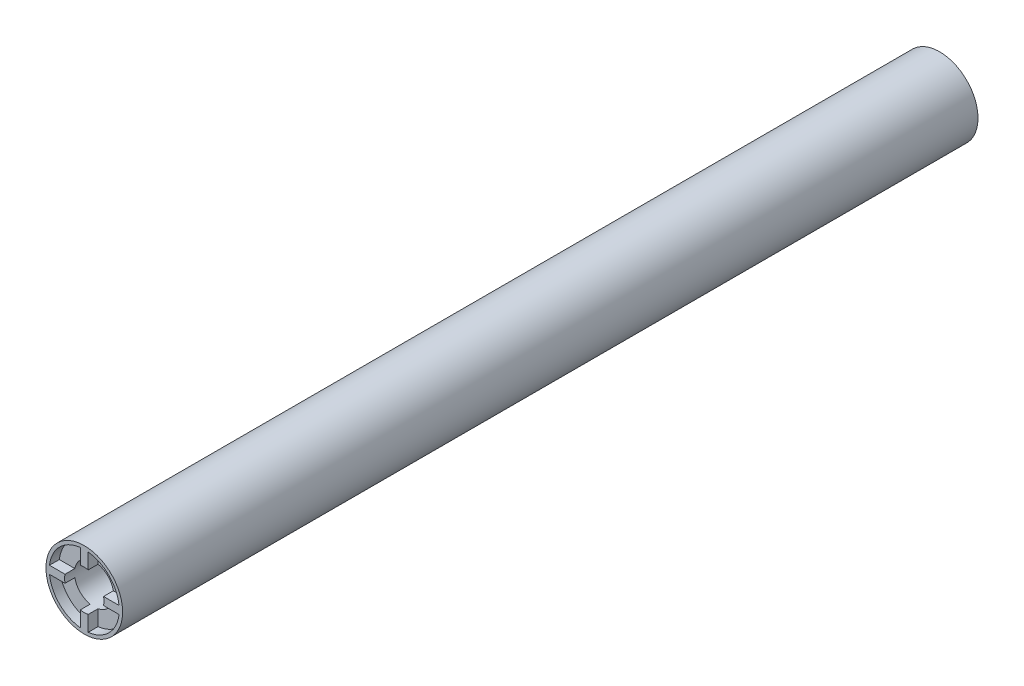
ISO-10303-21;
HEADER;
FILE_DESCRIPTION(('STEP AP214'),'2;1');
FILE_NAME('part.step','',(''),(''),'','','');
FILE_SCHEMA(('AUTOMOTIVE_DESIGN { 1 0 10303 214 1 1 1 1 }'));
ENDSEC;
DATA;
#1=APPLICATION_CONTEXT('core data for automotive mechanical design processes');
#2=APPLICATION_PROTOCOL_DEFINITION('international standard','automotive_design',2000,#1);
#3=PRODUCT_CONTEXT('',#1,'mechanical');
#4=PRODUCT('Part','Part','',(#3));
#5=PRODUCT_RELATED_PRODUCT_CATEGORY('part','',(#4));
#6=PRODUCT_DEFINITION_FORMATION('','',#4);
#7=PRODUCT_DEFINITION_CONTEXT('part definition',#1,'design');
#8=PRODUCT_DEFINITION('design','',#6,#7);
#9=PRODUCT_DEFINITION_SHAPE('','',#8);
#10=(LENGTH_UNIT() NAMED_UNIT(*) SI_UNIT(.MILLI.,.METRE.));
#11=(NAMED_UNIT(*) PLANE_ANGLE_UNIT() SI_UNIT($,.RADIAN.));
#12=(NAMED_UNIT(*) SI_UNIT($,.STERADIAN.) SOLID_ANGLE_UNIT());
#13=UNCERTAINTY_MEASURE_WITH_UNIT(LENGTH_MEASURE(1.E-05),#10,'distance_accuracy_value','');
#14=(GEOMETRIC_REPRESENTATION_CONTEXT(3) GLOBAL_UNCERTAINTY_ASSIGNED_CONTEXT((#13)) GLOBAL_UNIT_ASSIGNED_CONTEXT((#10,
#11,#12)) REPRESENTATION_CONTEXT('',''));
#15=CARTESIAN_POINT('',(0.,0.,0.));
#16=DIRECTION('',(0.,0.,1.));
#17=DIRECTION('',(1.,0.,0.));
#18=AXIS2_PLACEMENT_3D('',#15,#16,#17);
#19=CARTESIAN_POINT('',(0.,0.,0.));
#20=DIRECTION('',(0.,0.,1.));
#21=DIRECTION('',(1.,0.,0.));
#22=AXIS2_PLACEMENT_3D('',#19,#20,#21);
#23=PLANE('',#22);
#24=CARTESIAN_POINT('',(0.,0.,0.));
#25=DIRECTION('',(0.,0.,1.));
#26=DIRECTION('',(1.,0.,0.));
#27=AXIS2_PLACEMENT_3D('',#24,#25,#26);
#28=CIRCLE('',#27,1.);
#29=CARTESIAN_POINT('',(0.2,-0.979795897113271,0.));
#30=VERTEX_POINT('',#29);
#31=CARTESIAN_POINT('',(0.979795897113271,-0.2,0.));
#32=VERTEX_POINT('',#31);
#33=EDGE_CURVE('E158',#30,#32,#28,.T.);
#34=ORIENTED_EDGE('',*,*,#33,.F.);
#35=DIRECTION('',(0.,-1.,0.));
#36=VECTOR('',#35,1.);
#37=CARTESIAN_POINT('',(0.2,0.,0.));
#38=LINE('',#37,#36);
#39=CARTESIAN_POINT('',(0.2,-1.76872835675804,0.));
#40=VERTEX_POINT('',#39);
#41=EDGE_CURVE('E51',#30,#40,#38,.T.);
#42=ORIENTED_EDGE('',*,*,#41,.T.);
#43=CARTESIAN_POINT('',(0.,0.,0.));
#44=DIRECTION('',(0.,0.,1.));
#45=DIRECTION('',(1.,0.,0.));
#46=AXIS2_PLACEMENT_3D('',#43,#44,#45);
#47=CIRCLE('',#46,1.78);
#48=CARTESIAN_POINT('',(1.76872835675804,-0.2,0.));
#49=VERTEX_POINT('',#48);
#50=EDGE_CURVE('E56',#40,#49,#47,.T.);
#51=ORIENTED_EDGE('',*,*,#50,.T.);
#52=DIRECTION('',(1.,0.,0.));
#53=VECTOR('',#52,1.);
#54=CARTESIAN_POINT('',(0.,-0.2,0.));
#55=LINE('',#54,#53);
#56=EDGE_CURVE('E231',#32,#49,#55,.T.);
#57=ORIENTED_EDGE('',*,*,#56,.F.);
#58=EDGE_LOOP('',(#34,#42,#51,#57));
#59=FACE_BOUND('',#58,.T.);
#60=ADVANCED_FACE('F36',(#59),#23,.T.);
#61=CARTESIAN_POINT('',(0.979795897113271,0.2,0.));
#62=VERTEX_POINT('',#61);
#63=CARTESIAN_POINT('',(0.2,0.979795897113271,0.));
#64=VERTEX_POINT('',#63);
#65=EDGE_CURVE('E278',#62,#64,#28,.T.);
#66=ORIENTED_EDGE('',*,*,#65,.F.);
#67=DIRECTION('',(1.,0.,0.));
#68=VECTOR('',#67,1.);
#69=CARTESIAN_POINT('',(0.,0.2,0.));
#70=LINE('',#69,#68);
#71=CARTESIAN_POINT('',(1.76872835675804,0.2,0.));
#72=VERTEX_POINT('',#71);
#73=EDGE_CURVE('E229',#62,#72,#70,.T.);
#74=ORIENTED_EDGE('',*,*,#73,.T.);
#75=CARTESIAN_POINT('',(0.,0.,0.));
#76=DIRECTION('',(0.,0.,1.));
#77=DIRECTION('',(1.,0.,0.));
#78=AXIS2_PLACEMENT_3D('',#75,#76,#77);
#79=CIRCLE('',#78,1.78);
#80=CARTESIAN_POINT('',(0.2,1.76872835675804,0.));
#81=VERTEX_POINT('',#80);
#82=EDGE_CURVE('E227',#72,#81,#79,.T.);
#83=ORIENTED_EDGE('',*,*,#82,.T.);
#84=DIRECTION('',(0.,-1.,0.));
#85=VECTOR('',#84,1.);
#86=CARTESIAN_POINT('',(0.2,0.,0.));
#87=LINE('',#86,#85);
#88=EDGE_CURVE('E225',#81,#64,#87,.T.);
#89=ORIENTED_EDGE('',*,*,#88,.T.);
#90=EDGE_LOOP('',(#66,#74,#83,#89));
#91=FACE_BOUND('',#90,.T.);
#92=ADVANCED_FACE('F304',(#91),#23,.T.);
#93=DIRECTION('',(0.,-1.,0.));
#94=VECTOR('',#93,1.);
#95=CARTESIAN_POINT('',(-0.2,0.,0.));
#96=LINE('',#95,#94);
#97=CARTESIAN_POINT('',(-0.2,1.76872835675804,0.));
#98=VERTEX_POINT('',#97);
#99=CARTESIAN_POINT('',(-0.2,0.979795897113271,0.));
#100=VERTEX_POINT('',#99);
#101=EDGE_CURVE('E222',#98,#100,#96,.T.);
#102=ORIENTED_EDGE('',*,*,#101,.F.);
#103=CARTESIAN_POINT('',(0.,0.,0.));
#104=DIRECTION('',(0.,0.,1.));
#105=DIRECTION('',(1.,0.,0.));
#106=AXIS2_PLACEMENT_3D('',#103,#104,#105);
#107=CIRCLE('',#106,1.78);
#108=CARTESIAN_POINT('',(-1.76872835675804,0.2,0.));
#109=VERTEX_POINT('',#108);
#110=EDGE_CURVE('E220',#98,#109,#107,.T.);
#111=ORIENTED_EDGE('',*,*,#110,.T.);
#112=DIRECTION('',(1.,0.,0.));
#113=VECTOR('',#112,1.);
#114=CARTESIAN_POINT('',(0.,0.2,0.));
#115=LINE('',#114,#113);
#116=CARTESIAN_POINT('',(-0.979795897113271,0.2,0.));
#117=VERTEX_POINT('',#116);
#118=EDGE_CURVE('E218',#109,#117,#115,.T.);
#119=ORIENTED_EDGE('',*,*,#118,.T.);
#120=EDGE_CURVE('E280',#100,#117,#28,.T.);
#121=ORIENTED_EDGE('',*,*,#120,.F.);
#122=EDGE_LOOP('',(#102,#111,#119,#121));
#123=FACE_BOUND('',#122,.T.);
#124=ADVANCED_FACE('F309',(#123),#23,.T.);
#125=DIRECTION('',(0.,-1.,0.));
#126=VECTOR('',#125,1.);
#127=CARTESIAN_POINT('',(-0.2,0.,0.));
#128=LINE('',#127,#126);
#129=CARTESIAN_POINT('',(-0.2,-0.979795897113271,0.));
#130=VERTEX_POINT('',#129);
#131=CARTESIAN_POINT('',(-0.2,-1.76872835675804,0.));
#132=VERTEX_POINT('',#131);
#133=EDGE_CURVE('E176',#130,#132,#128,.T.);
#134=ORIENTED_EDGE('',*,*,#133,.F.);
#135=CARTESIAN_POINT('',(-0.979795897113271,-0.2,0.));
#136=VERTEX_POINT('',#135);
#137=EDGE_CURVE('E284',#136,#130,#28,.T.);
#138=ORIENTED_EDGE('',*,*,#137,.F.);
#139=DIRECTION('',(1.,0.,0.));
#140=VECTOR('',#139,1.);
#141=CARTESIAN_POINT('',(0.,-0.2,0.));
#142=LINE('',#141,#140);
#143=CARTESIAN_POINT('',(-1.76872835675804,-0.2,0.));
#144=VERTEX_POINT('',#143);
#145=EDGE_CURVE('E216',#144,#136,#142,.T.);
#146=ORIENTED_EDGE('',*,*,#145,.F.);
#147=CARTESIAN_POINT('',(0.,0.,0.));
#148=DIRECTION('',(0.,0.,1.));
#149=DIRECTION('',(1.,0.,0.));
#150=AXIS2_PLACEMENT_3D('',#147,#148,#149);
#151=CIRCLE('',#150,1.78);
#152=EDGE_CURVE('E155',#144,#132,#151,.T.);
#153=ORIENTED_EDGE('',*,*,#152,.T.);
#154=EDGE_LOOP('',(#134,#138,#146,#153));
#155=FACE_BOUND('',#154,.T.);
#156=ADVANCED_FACE('F305',(#155),#23,.T.);
#157=CARTESIAN_POINT('',(0.,0.,-8.));
#158=DIRECTION('',(0.,0.,1.));
#159=DIRECTION('',(1.,0.,0.));
#160=AXIS2_PLACEMENT_3D('',#157,#158,#159);
#161=CYLINDRICAL_SURFACE('',#160,1.);
#162=CARTESIAN_POINT('',(0.,0.,-8.));
#163=DIRECTION('',(0.,0.,1.));
#164=DIRECTION('',(1.,0.,0.));
#165=AXIS2_PLACEMENT_3D('',#162,#163,#164);
#166=CIRCLE('',#165,1.);
#167=CARTESIAN_POINT('',(1.,0.,-8.));
#168=VERTEX_POINT('',#167);
#169=EDGE_CURVE('E44',#168,#168,#166,.T.);
#170=ORIENTED_EDGE('',*,*,#169,.F.);
#171=EDGE_LOOP('',(#170));
#172=FACE_BOUND('',#171,.T.);
#173=ORIENTED_EDGE('',*,*,#65,.T.);
#174=DIRECTION('',(0.,0.,-1.));
#175=VECTOR('',#174,1.);
#176=CARTESIAN_POINT('',(0.2,0.979795897113271,0.5));
#177=LINE('',#176,#175);
#178=CARTESIAN_POINT('',(0.2,0.979795897113271,0.5));
#179=VERTEX_POINT('',#178);
#180=EDGE_CURVE('E261',#179,#64,#177,.T.);
#181=ORIENTED_EDGE('',*,*,#180,.F.);
#182=CARTESIAN_POINT('',(0.,0.,0.5));
#183=DIRECTION('',(0.,0.,1.));
#184=DIRECTION('',(1.,0.,0.));
#185=AXIS2_PLACEMENT_3D('',#182,#183,#184);
#186=CIRCLE('',#185,1.);
#187=CARTESIAN_POINT('',(-0.2,0.979795897113271,0.5));
#188=VERTEX_POINT('',#187);
#189=EDGE_CURVE('E189',#188,#179,#186,.F.);
#190=ORIENTED_EDGE('',*,*,#189,.F.);
#191=DIRECTION('',(0.,0.,-1.));
#192=VECTOR('',#191,1.);
#193=CARTESIAN_POINT('',(-0.2,0.979795897113271,0.5));
#194=LINE('',#193,#192);
#195=EDGE_CURVE('E264',#188,#100,#194,.T.);
#196=ORIENTED_EDGE('',*,*,#195,.T.);
#197=ORIENTED_EDGE('',*,*,#120,.T.);
#198=DIRECTION('',(0.,0.,-1.));
#199=VECTOR('',#198,1.);
#200=CARTESIAN_POINT('',(-0.979795897113271,0.2,0.5));
#201=LINE('',#200,#199);
#202=CARTESIAN_POINT('',(-0.979795897113271,0.2,0.5));
#203=VERTEX_POINT('',#202);
#204=EDGE_CURVE('E273',#203,#117,#201,.T.);
#205=ORIENTED_EDGE('',*,*,#204,.F.);
#206=CARTESIAN_POINT('',(0.,0.,0.5));
#207=DIRECTION('',(0.,0.,1.));
#208=DIRECTION('',(1.,0.,0.));
#209=AXIS2_PLACEMENT_3D('',#206,#207,#208);
#210=CIRCLE('',#209,1.);
#211=CARTESIAN_POINT('',(-0.979795897113271,-0.2,0.5));
#212=VERTEX_POINT('',#211);
#213=EDGE_CURVE('E167',#212,#203,#210,.F.);
#214=ORIENTED_EDGE('',*,*,#213,.F.);
#215=DIRECTION('',(0.,0.,-1.));
#216=VECTOR('',#215,1.);
#217=CARTESIAN_POINT('',(-0.979795897113271,-0.2,0.5));
#218=LINE('',#217,#216);
#219=EDGE_CURVE('E159',#212,#136,#218,.T.);
#220=ORIENTED_EDGE('',*,*,#219,.T.);
#221=ORIENTED_EDGE('',*,*,#137,.T.);
#222=DIRECTION('',(0.,0.,-1.));
#223=VECTOR('',#222,1.);
#224=CARTESIAN_POINT('',(-0.2,-0.979795897113271,0.5));
#225=LINE('',#224,#223);
#226=CARTESIAN_POINT('',(-0.2,-0.979795897113271,0.5));
#227=VERTEX_POINT('',#226);
#228=EDGE_CURVE('E239',#227,#130,#225,.T.);
#229=ORIENTED_EDGE('',*,*,#228,.F.);
#230=CARTESIAN_POINT('',(0.,0.,0.5));
#231=DIRECTION('',(0.,0.,1.));
#232=DIRECTION('',(1.,0.,0.));
#233=AXIS2_PLACEMENT_3D('',#230,#231,#232);
#234=CIRCLE('',#233,1.);
#235=CARTESIAN_POINT('',(0.2,-0.979795897113271,0.5));
#236=VERTEX_POINT('',#235);
#237=EDGE_CURVE('E211',#236,#227,#234,.F.);
#238=ORIENTED_EDGE('',*,*,#237,.F.);
#239=DIRECTION('',(0.,0.,-1.));
#240=VECTOR('',#239,1.);
#241=CARTESIAN_POINT('',(0.2,-0.979795897113271,0.5));
#242=LINE('',#241,#240);
#243=EDGE_CURVE('E242',#236,#30,#242,.T.);
#244=ORIENTED_EDGE('',*,*,#243,.T.);
#245=ORIENTED_EDGE('',*,*,#33,.T.);
#246=DIRECTION('',(0.,0.,-1.));
#247=VECTOR('',#246,1.);
#248=CARTESIAN_POINT('',(0.979795897113271,-0.2,0.5));
#249=LINE('',#248,#247);
#250=CARTESIAN_POINT('',(0.979795897113271,-0.2,0.5));
#251=VERTEX_POINT('',#250);
#252=EDGE_CURVE('E249',#251,#32,#249,.T.);
#253=ORIENTED_EDGE('',*,*,#252,.F.);
#254=CARTESIAN_POINT('',(0.,0.,0.5));
#255=DIRECTION('',(0.,0.,1.));
#256=DIRECTION('',(1.,0.,0.));
#257=AXIS2_PLACEMENT_3D('',#254,#255,#256);
#258=CIRCLE('',#257,1.);
#259=CARTESIAN_POINT('',(0.979795897113271,0.2,0.5));
#260=VERTEX_POINT('',#259);
#261=EDGE_CURVE('E200',#260,#251,#258,.F.);
#262=ORIENTED_EDGE('',*,*,#261,.F.);
#263=DIRECTION('',(0.,0.,-1.));
#264=VECTOR('',#263,1.);
#265=CARTESIAN_POINT('',(0.979795897113271,0.2,0.5));
#266=LINE('',#265,#264);
#267=EDGE_CURVE('E252',#260,#62,#266,.T.);
#268=ORIENTED_EDGE('',*,*,#267,.T.);
#269=EDGE_LOOP('',(#173,#181,#190,#196,#197,#205,#214,#220,#221,#229,#238,#244,#245,#253,#262,#268));
#270=FACE_BOUND('',#269,.T.);
#271=ADVANCED_FACE('F289',(#172,#270),#161,.F.);
#272=CARTESIAN_POINT('',(0.,0.,-8.));
#273=DIRECTION('',(0.,0.,1.));
#274=DIRECTION('',(1.,0.,0.));
#275=AXIS2_PLACEMENT_3D('',#272,#273,#274);
#276=PLANE('',#275);
#277=ORIENTED_EDGE('',*,*,#169,.T.);
#278=EDGE_LOOP('',(#277));
#279=FACE_BOUND('',#278,.T.);
#280=ADVANCED_FACE('F317',(#279),#276,.T.);
#281=CARTESIAN_POINT('',(0.,0.,0.5));
#282=DIRECTION('',(0.,0.,-1.));
#283=DIRECTION('',(-1.,0.,0.));
#284=AXIS2_PLACEMENT_3D('',#281,#282,#283);
#285=CYLINDRICAL_SURFACE('',#284,1.78);
#286=ORIENTED_EDGE('',*,*,#152,.F.);
#287=DIRECTION('',(0.,0.,-1.));
#288=VECTOR('',#287,1.);
#289=CARTESIAN_POINT('',(-1.76872835675804,-0.2,0.5));
#290=LINE('',#289,#288);
#291=CARTESIAN_POINT('',(-1.76872835675804,-0.2,0.5));
#292=VERTEX_POINT('',#291);
#293=EDGE_CURVE('E149',#292,#144,#290,.T.);
#294=ORIENTED_EDGE('',*,*,#293,.F.);
#295=CARTESIAN_POINT('',(0.,0.,0.5));
#296=DIRECTION('',(0.,0.,1.));
#297=DIRECTION('',(1.,0.,0.));
#298=AXIS2_PLACEMENT_3D('',#295,#296,#297);
#299=CIRCLE('',#298,1.78);
#300=CARTESIAN_POINT('',(-0.2,-1.76872835675804,0.5));
#301=VERTEX_POINT('',#300);
#302=EDGE_CURVE('E154',#292,#301,#299,.T.);
#303=ORIENTED_EDGE('',*,*,#302,.T.);
#304=DIRECTION('',(0.,0.,-1.));
#305=VECTOR('',#304,1.);
#306=CARTESIAN_POINT('',(-0.2,-1.76872835675804,0.5));
#307=LINE('',#306,#305);
#308=EDGE_CURVE('E214',#301,#132,#307,.T.);
#309=ORIENTED_EDGE('',*,*,#308,.T.);
#310=EDGE_LOOP('',(#286,#294,#303,#309));
#311=FACE_BOUND('',#310,.T.);
#312=ADVANCED_FACE('F151',(#311),#285,.F.);
#313=CARTESIAN_POINT('',(0.,-0.2,0.5));
#314=DIRECTION('',(0.,1.,0.));
#315=DIRECTION('',(-1.,0.,0.));
#316=AXIS2_PLACEMENT_3D('',#313,#314,#315);
#317=PLANE('',#316);
#318=ORIENTED_EDGE('',*,*,#145,.T.);
#319=ORIENTED_EDGE('',*,*,#219,.F.);
#320=DIRECTION('',(1.,0.,0.));
#321=VECTOR('',#320,1.);
#322=CARTESIAN_POINT('',(0.,-0.2,0.5));
#323=LINE('',#322,#321);
#324=EDGE_CURVE('E163',#292,#212,#323,.T.);
#325=ORIENTED_EDGE('',*,*,#324,.F.);
#326=ORIENTED_EDGE('',*,*,#293,.T.);
#327=EDGE_LOOP('',(#318,#319,#325,#326));
#328=FACE_BOUND('',#327,.T.);
#329=ADVANCED_FACE('F164',(#328),#317,.F.);
#330=CARTESIAN_POINT('',(0.,0.2,0.5));
#331=DIRECTION('',(0.,1.,0.));
#332=DIRECTION('',(-1.,0.,0.));
#333=AXIS2_PLACEMENT_3D('',#330,#331,#332);
#334=PLANE('',#333);
#335=ORIENTED_EDGE('',*,*,#118,.F.);
#336=DIRECTION('',(0.,0.,-1.));
#337=VECTOR('',#336,1.);
#338=CARTESIAN_POINT('',(-1.76872835675804,0.2,0.5));
#339=LINE('',#338,#337);
#340=CARTESIAN_POINT('',(-1.76872835675804,0.2,0.5));
#341=VERTEX_POINT('',#340);
#342=EDGE_CURVE('E270',#341,#109,#339,.T.);
#343=ORIENTED_EDGE('',*,*,#342,.F.);
#344=DIRECTION('',(1.,0.,0.));
#345=VECTOR('',#344,1.);
#346=CARTESIAN_POINT('',(0.,0.2,0.5));
#347=LINE('',#346,#345);
#348=EDGE_CURVE('E180',#341,#203,#347,.T.);
#349=ORIENTED_EDGE('',*,*,#348,.T.);
#350=ORIENTED_EDGE('',*,*,#204,.T.);
#351=EDGE_LOOP('',(#335,#343,#349,#350));
#352=FACE_BOUND('',#351,.T.);
#353=ADVANCED_FACE('F334',(#352),#334,.T.);
#354=CARTESIAN_POINT('',(0.,0.,0.5));
#355=DIRECTION('',(0.,0.,-1.));
#356=DIRECTION('',(-1.,0.,0.));
#357=AXIS2_PLACEMENT_3D('',#354,#355,#356);
#358=CYLINDRICAL_SURFACE('',#357,1.78);
#359=ORIENTED_EDGE('',*,*,#110,.F.);
#360=DIRECTION('',(0.,0.,-1.));
#361=VECTOR('',#360,1.);
#362=CARTESIAN_POINT('',(-0.2,1.76872835675804,0.5));
#363=LINE('',#362,#361);
#364=CARTESIAN_POINT('',(-0.2,1.76872835675804,0.5));
#365=VERTEX_POINT('',#364);
#366=EDGE_CURVE('E267',#365,#98,#363,.T.);
#367=ORIENTED_EDGE('',*,*,#366,.F.);
#368=CARTESIAN_POINT('',(0.,0.,0.5));
#369=DIRECTION('',(0.,0.,1.));
#370=DIRECTION('',(1.,0.,0.));
#371=AXIS2_PLACEMENT_3D('',#368,#369,#370);
#372=CIRCLE('',#371,1.78);
#373=EDGE_CURVE('E183',#365,#341,#372,.T.);
#374=ORIENTED_EDGE('',*,*,#373,.T.);
#375=ORIENTED_EDGE('',*,*,#342,.T.);
#376=EDGE_LOOP('',(#359,#367,#374,#375));
#377=FACE_BOUND('',#376,.T.);
#378=ADVANCED_FACE('F330',(#377),#358,.F.);
#379=CARTESIAN_POINT('',(-0.2,0.,0.5));
#380=DIRECTION('',(1.,0.,0.));
#381=DIRECTION('',(0.,1.,0.));
#382=AXIS2_PLACEMENT_3D('',#379,#380,#381);
#383=PLANE('',#382);
#384=ORIENTED_EDGE('',*,*,#101,.T.);
#385=ORIENTED_EDGE('',*,*,#195,.F.);
#386=DIRECTION('',(0.,-1.,0.));
#387=VECTOR('',#386,1.);
#388=CARTESIAN_POINT('',(-0.2,0.,0.5));
#389=LINE('',#388,#387);
#390=EDGE_CURVE('E186',#365,#188,#389,.T.);
#391=ORIENTED_EDGE('',*,*,#390,.F.);
#392=ORIENTED_EDGE('',*,*,#366,.T.);
#393=EDGE_LOOP('',(#384,#385,#391,#392));
#394=FACE_BOUND('',#393,.T.);
#395=ADVANCED_FACE('F327',(#394),#383,.F.);
#396=CARTESIAN_POINT('',(0.2,0.,0.5));
#397=DIRECTION('',(1.,0.,0.));
#398=DIRECTION('',(0.,1.,0.));
#399=AXIS2_PLACEMENT_3D('',#396,#397,#398);
#400=PLANE('',#399);
#401=ORIENTED_EDGE('',*,*,#88,.F.);
#402=DIRECTION('',(0.,0.,-1.));
#403=VECTOR('',#402,1.);
#404=CARTESIAN_POINT('',(0.2,1.76872835675804,0.5));
#405=LINE('',#404,#403);
#406=CARTESIAN_POINT('',(0.2,1.76872835675804,0.5));
#407=VERTEX_POINT('',#406);
#408=EDGE_CURVE('E258',#407,#81,#405,.T.);
#409=ORIENTED_EDGE('',*,*,#408,.F.);
#410=DIRECTION('',(0.,-1.,0.));
#411=VECTOR('',#410,1.);
#412=CARTESIAN_POINT('',(0.2,0.,0.5));
#413=LINE('',#412,#411);
#414=EDGE_CURVE('E191',#407,#179,#413,.T.);
#415=ORIENTED_EDGE('',*,*,#414,.T.);
#416=ORIENTED_EDGE('',*,*,#180,.T.);
#417=EDGE_LOOP('',(#401,#409,#415,#416));
#418=FACE_BOUND('',#417,.T.);
#419=ADVANCED_FACE('F348',(#418),#400,.T.);
#420=CARTESIAN_POINT('',(0.,0.,0.5));
#421=DIRECTION('',(0.,0.,-1.));
#422=DIRECTION('',(-1.,0.,0.));
#423=AXIS2_PLACEMENT_3D('',#420,#421,#422);
#424=CYLINDRICAL_SURFACE('',#423,1.78);
#425=ORIENTED_EDGE('',*,*,#82,.F.);
#426=DIRECTION('',(0.,0.,-1.));
#427=VECTOR('',#426,1.);
#428=CARTESIAN_POINT('',(1.76872835675804,0.2,0.5));
#429=LINE('',#428,#427);
#430=CARTESIAN_POINT('',(1.76872835675804,0.2,0.5));
#431=VERTEX_POINT('',#430);
#432=EDGE_CURVE('E255',#431,#72,#429,.T.);
#433=ORIENTED_EDGE('',*,*,#432,.F.);
#434=CARTESIAN_POINT('',(0.,0.,0.5));
#435=DIRECTION('',(0.,0.,1.));
#436=DIRECTION('',(1.,0.,0.));
#437=AXIS2_PLACEMENT_3D('',#434,#435,#436);
#438=CIRCLE('',#437,1.78);
#439=EDGE_CURVE('E194',#431,#407,#438,.T.);
#440=ORIENTED_EDGE('',*,*,#439,.T.);
#441=ORIENTED_EDGE('',*,*,#408,.T.);
#442=EDGE_LOOP('',(#425,#433,#440,#441));
#443=FACE_BOUND('',#442,.T.);
#444=ADVANCED_FACE('F342',(#443),#424,.F.);
#445=CARTESIAN_POINT('',(0.,0.2,0.5));
#446=DIRECTION('',(0.,1.,0.));
#447=DIRECTION('',(0.,0.,1.));
#448=AXIS2_PLACEMENT_3D('',#445,#446,#447);
#449=PLANE('',#448);
#450=ORIENTED_EDGE('',*,*,#73,.F.);
#451=ORIENTED_EDGE('',*,*,#267,.F.);
#452=DIRECTION('',(1.,0.,0.));
#453=VECTOR('',#452,1.);
#454=CARTESIAN_POINT('',(0.,0.2,0.5));
#455=LINE('',#454,#453);
#456=EDGE_CURVE('E197',#260,#431,#455,.T.);
#457=ORIENTED_EDGE('',*,*,#456,.T.);
#458=ORIENTED_EDGE('',*,*,#432,.T.);
#459=EDGE_LOOP('',(#450,#451,#457,#458));
#460=FACE_BOUND('',#459,.T.);
#461=ADVANCED_FACE('F346',(#460),#449,.T.);
#462=CARTESIAN_POINT('',(0.,-0.2,0.5));
#463=DIRECTION('',(0.,1.,0.));
#464=DIRECTION('',(0.,0.,1.));
#465=AXIS2_PLACEMENT_3D('',#462,#463,#464);
#466=PLANE('',#465);
#467=ORIENTED_EDGE('',*,*,#56,.T.);
#468=DIRECTION('',(0.,0.,-1.));
#469=VECTOR('',#468,1.);
#470=CARTESIAN_POINT('',(1.76872835675804,-0.2,0.5));
#471=LINE('',#470,#469);
#472=CARTESIAN_POINT('',(1.76872835675804,-0.2,0.5));
#473=VERTEX_POINT('',#472);
#474=EDGE_CURVE('E247',#473,#49,#471,.T.);
#475=ORIENTED_EDGE('',*,*,#474,.F.);
#476=DIRECTION('',(1.,0.,0.));
#477=VECTOR('',#476,1.);
#478=CARTESIAN_POINT('',(0.,-0.2,0.5));
#479=LINE('',#478,#477);
#480=EDGE_CURVE('E203',#251,#473,#479,.T.);
#481=ORIENTED_EDGE('',*,*,#480,.F.);
#482=ORIENTED_EDGE('',*,*,#252,.T.);
#483=EDGE_LOOP('',(#467,#475,#481,#482));
#484=FACE_BOUND('',#483,.T.);
#485=ADVANCED_FACE('F302',(#484),#466,.F.);
#486=CARTESIAN_POINT('',(0.,0.,0.5));
#487=DIRECTION('',(0.,0.,-1.));
#488=DIRECTION('',(-1.,0.,0.));
#489=AXIS2_PLACEMENT_3D('',#486,#487,#488);
#490=CYLINDRICAL_SURFACE('',#489,1.78);
#491=ORIENTED_EDGE('',*,*,#50,.F.);
#492=DIRECTION('',(0.,0.,-1.));
#493=VECTOR('',#492,1.);
#494=CARTESIAN_POINT('',(0.2,-1.76872835675804,0.5));
#495=LINE('',#494,#493);
#496=CARTESIAN_POINT('',(0.2,-1.76872835675804,0.5));
#497=VERTEX_POINT('',#496);
#498=EDGE_CURVE('E245',#497,#40,#495,.T.);
#499=ORIENTED_EDGE('',*,*,#498,.F.);
#500=CARTESIAN_POINT('',(0.,0.,0.5));
#501=DIRECTION('',(0.,0.,1.));
#502=DIRECTION('',(1.,0.,0.));
#503=AXIS2_PLACEMENT_3D('',#500,#501,#502);
#504=CIRCLE('',#503,1.78);
#505=EDGE_CURVE('E205',#497,#473,#504,.T.);
#506=ORIENTED_EDGE('',*,*,#505,.T.);
#507=ORIENTED_EDGE('',*,*,#474,.T.);
#508=EDGE_LOOP('',(#491,#499,#506,#507));
#509=FACE_BOUND('',#508,.T.);
#510=ADVANCED_FACE('F299',(#509),#490,.F.);
#511=CARTESIAN_POINT('',(0.2,0.,0.5));
#512=DIRECTION('',(1.,0.,0.));
#513=DIRECTION('',(0.,1.,0.));
#514=AXIS2_PLACEMENT_3D('',#511,#512,#513);
#515=PLANE('',#514);
#516=ORIENTED_EDGE('',*,*,#41,.F.);
#517=ORIENTED_EDGE('',*,*,#243,.F.);
#518=DIRECTION('',(0.,-1.,0.));
#519=VECTOR('',#518,1.);
#520=CARTESIAN_POINT('',(0.2,0.,0.5));
#521=LINE('',#520,#519);
#522=EDGE_CURVE('E208',#236,#497,#521,.T.);
#523=ORIENTED_EDGE('',*,*,#522,.T.);
#524=ORIENTED_EDGE('',*,*,#498,.T.);
#525=EDGE_LOOP('',(#516,#517,#523,#524));
#526=FACE_BOUND('',#525,.T.);
#527=ADVANCED_FACE('F297',(#526),#515,.T.);
#528=CARTESIAN_POINT('',(-0.2,0.,0.5));
#529=DIRECTION('',(1.,0.,0.));
#530=DIRECTION('',(0.,1.,0.));
#531=AXIS2_PLACEMENT_3D('',#528,#529,#530);
#532=PLANE('',#531);
#533=ORIENTED_EDGE('',*,*,#133,.T.);
#534=ORIENTED_EDGE('',*,*,#308,.F.);
#535=DIRECTION('',(0.,-1.,0.));
#536=VECTOR('',#535,1.);
#537=CARTESIAN_POINT('',(-0.2,0.,0.5));
#538=LINE('',#537,#536);
#539=EDGE_CURVE('E171',#227,#301,#538,.T.);
#540=ORIENTED_EDGE('',*,*,#539,.F.);
#541=ORIENTED_EDGE('',*,*,#228,.T.);
#542=EDGE_LOOP('',(#533,#534,#540,#541));
#543=FACE_BOUND('',#542,.T.);
#544=ADVANCED_FACE('F293',(#543),#532,.F.);
#545=CARTESIAN_POINT('',(0.,0.,0.5));
#546=DIRECTION('',(0.,0.,1.));
#547=DIRECTION('',(1.,0.,0.));
#548=AXIS2_PLACEMENT_3D('',#545,#546,#547);
#549=PLANE('',#548);
#550=CARTESIAN_POINT('',(0.,0.,0.5));
#551=DIRECTION('',(0.,0.,1.));
#552=DIRECTION('',(1.,0.,0.));
#553=AXIS2_PLACEMENT_3D('',#550,#551,#552);
#554=CIRCLE('',#553,1.95);
#555=CARTESIAN_POINT('',(1.95,0.,0.5));
#556=VERTEX_POINT('',#555);
#557=EDGE_CURVE('E173',#556,#556,#554,.T.);
#558=ORIENTED_EDGE('',*,*,#557,.T.);
#559=EDGE_LOOP('',(#558));
#560=FACE_BOUND('',#559,.T.);
#561=ORIENTED_EDGE('',*,*,#302,.F.);
#562=ORIENTED_EDGE('',*,*,#324,.T.);
#563=ORIENTED_EDGE('',*,*,#213,.T.);
#564=ORIENTED_EDGE('',*,*,#348,.F.);
#565=ORIENTED_EDGE('',*,*,#373,.F.);
#566=ORIENTED_EDGE('',*,*,#390,.T.);
#567=ORIENTED_EDGE('',*,*,#189,.T.);
#568=ORIENTED_EDGE('',*,*,#414,.F.);
#569=ORIENTED_EDGE('',*,*,#439,.F.);
#570=ORIENTED_EDGE('',*,*,#456,.F.);
#571=ORIENTED_EDGE('',*,*,#261,.T.);
#572=ORIENTED_EDGE('',*,*,#480,.T.);
#573=ORIENTED_EDGE('',*,*,#505,.F.);
#574=ORIENTED_EDGE('',*,*,#522,.F.);
#575=ORIENTED_EDGE('',*,*,#237,.T.);
#576=ORIENTED_EDGE('',*,*,#539,.T.);
#577=EDGE_LOOP('',(#561,#562,#563,#564,#565,#566,#567,#568,#569,#570,#571,#572,#573,#574,#575,#576));
#578=FACE_BOUND('',#577,.T.);
#579=ADVANCED_FACE('F169',(#560,#578),#549,.T.);
#580=CARTESIAN_POINT('',(0.,0.,-43.));
#581=DIRECTION('',(0.,0.,1.));
#582=DIRECTION('',(1.,0.,0.));
#583=AXIS2_PLACEMENT_3D('',#580,#581,#582);
#584=PLANE('',#583);
#585=CARTESIAN_POINT('',(0.,0.,-43.));
#586=DIRECTION('',(0.,0.,1.));
#587=DIRECTION('',(1.,0.,0.));
#588=AXIS2_PLACEMENT_3D('',#585,#586,#587);
#589=CIRCLE('',#588,1.95);
#590=CARTESIAN_POINT('',(1.95,0.,-43.));
#591=VERTEX_POINT('',#590);
#592=EDGE_CURVE('E11',#591,#591,#589,.T.);
#593=ORIENTED_EDGE('',*,*,#592,.F.);
#594=EDGE_LOOP('',(#593));
#595=FACE_BOUND('',#594,.T.);
#596=ADVANCED_FACE('F369',(#595),#584,.F.);
#597=CARTESIAN_POINT('',(0.,0.,-43.));
#598=DIRECTION('',(0.,0.,1.));
#599=DIRECTION('',(1.,0.,0.));
#600=AXIS2_PLACEMENT_3D('',#597,#598,#599);
#601=CYLINDRICAL_SURFACE('',#600,1.95);
#602=ORIENTED_EDGE('',*,*,#592,.T.);
#603=EDGE_LOOP('',(#602));
#604=FACE_BOUND('',#603,.T.);
#605=ORIENTED_EDGE('',*,*,#557,.F.);
#606=EDGE_LOOP('',(#605));
#607=FACE_BOUND('',#606,.T.);
#608=ADVANCED_FACE('F38',(#604,#607),#601,.T.);
#609=CLOSED_SHELL('',(#60,#92,#124,#156,#271,#280,#312,#329,#353,#378,#395,#419,#444,#461,#485,
#510,#527,#544,#579,#596,#608));
#610=MANIFOLD_SOLID_BREP('B2',#609);
#611=ADVANCED_BREP_SHAPE_REPRESENTATION('',(#18,#610),#14);
#612=SHAPE_DEFINITION_REPRESENTATION(#9,#611);
ENDSEC;
END-ISO-10303-21;
